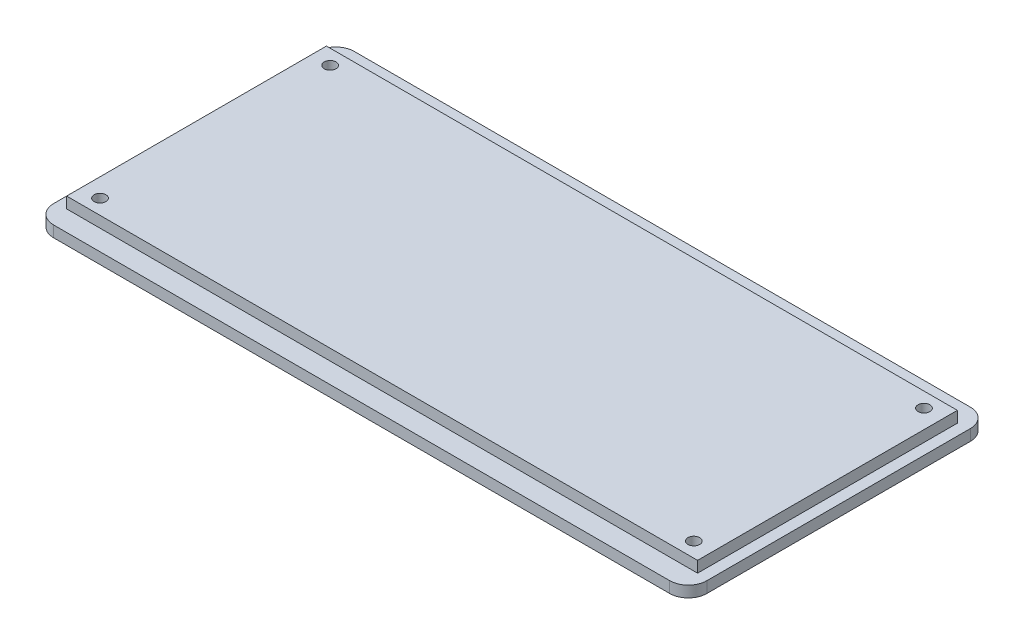
ISO-10303-21;
HEADER;
FILE_DESCRIPTION(('STEP AP214'),'2;1');
FILE_NAME('part.step','',(''),(''),'','','');
FILE_SCHEMA(('AUTOMOTIVE_DESIGN { 1 0 10303 214 1 1 1 1 }'));
ENDSEC;
DATA;
#1=APPLICATION_CONTEXT('core data for automotive mechanical design processes');
#2=APPLICATION_PROTOCOL_DEFINITION('international standard','automotive_design',2000,#1);
#3=PRODUCT_CONTEXT('',#1,'mechanical');
#4=PRODUCT('Part','Part','',(#3));
#5=PRODUCT_RELATED_PRODUCT_CATEGORY('part','',(#4));
#6=PRODUCT_DEFINITION_FORMATION('','',#4);
#7=PRODUCT_DEFINITION_CONTEXT('part definition',#1,'design');
#8=PRODUCT_DEFINITION('design','',#6,#7);
#9=PRODUCT_DEFINITION_SHAPE('','',#8);
#10=(LENGTH_UNIT() NAMED_UNIT(*) SI_UNIT(.MILLI.,.METRE.));
#11=(NAMED_UNIT(*) PLANE_ANGLE_UNIT() SI_UNIT($,.RADIAN.));
#12=(NAMED_UNIT(*) SI_UNIT($,.STERADIAN.) SOLID_ANGLE_UNIT());
#13=UNCERTAINTY_MEASURE_WITH_UNIT(LENGTH_MEASURE(1.E-05),#10,'distance_accuracy_value','');
#14=(GEOMETRIC_REPRESENTATION_CONTEXT(3) GLOBAL_UNCERTAINTY_ASSIGNED_CONTEXT((#13)) GLOBAL_UNIT_ASSIGNED_CONTEXT((#10,
#11,#12)) REPRESENTATION_CONTEXT('',''));
#15=CARTESIAN_POINT('',(0.,0.,0.));
#16=DIRECTION('',(0.,0.,1.));
#17=DIRECTION('',(1.,0.,0.));
#18=AXIS2_PLACEMENT_3D('',#15,#16,#17);
#19=CARTESIAN_POINT('',(80.,0.,-31.));
#20=DIRECTION('',(0.,1.,0.));
#21=DIRECTION('',(0.,0.,1.));
#22=AXIS2_PLACEMENT_3D('',#19,#20,#21);
#23=CYLINDRICAL_SURFACE('',#22,1.60000000000001);
#24=CARTESIAN_POINT('',(80.,6.,-31.));
#25=DIRECTION('',(0.,-1.,0.));
#26=DIRECTION('',(0.,0.,1.));
#27=AXIS2_PLACEMENT_3D('',#24,#25,#26);
#28=CIRCLE('',#27,1.60000000000001);
#29=CARTESIAN_POINT('',(80.,6.,-29.4));
#30=VERTEX_POINT('',#29);
#31=EDGE_CURVE('E248',#30,#30,#28,.T.);
#32=ORIENTED_EDGE('',*,*,#31,.F.);
#33=EDGE_LOOP('',(#32));
#34=FACE_BOUND('',#33,.T.);
#35=CARTESIAN_POINT('',(80.,2.,-31.));
#36=DIRECTION('',(0.,-1.,0.));
#37=DIRECTION('',(0.,0.,-1.));
#38=AXIS2_PLACEMENT_3D('',#35,#36,#37);
#39=CIRCLE('',#38,1.60000000000001);
#40=CARTESIAN_POINT('',(80.,2.,-32.6));
#41=VERTEX_POINT('',#40);
#42=EDGE_CURVE('E39',#41,#41,#39,.T.);
#43=ORIENTED_EDGE('',*,*,#42,.T.);
#44=EDGE_LOOP('',(#43));
#45=FACE_BOUND('',#44,.T.);
#46=ADVANCED_FACE('F35',(#34,#45),#23,.F.);
#47=CARTESIAN_POINT('',(80.,0.,31.));
#48=DIRECTION('',(0.,1.,0.));
#49=DIRECTION('',(0.,0.,1.));
#50=AXIS2_PLACEMENT_3D('',#47,#48,#49);
#51=CYLINDRICAL_SURFACE('',#50,1.60000000000001);
#52=CARTESIAN_POINT('',(80.,6.,31.));
#53=DIRECTION('',(0.,1.,0.));
#54=DIRECTION('',(0.,0.,-1.));
#55=AXIS2_PLACEMENT_3D('',#52,#53,#54);
#56=CIRCLE('',#55,1.60000000000001);
#57=CARTESIAN_POINT('',(80.,6.,29.4));
#58=VERTEX_POINT('',#57);
#59=EDGE_CURVE('E235',#58,#58,#56,.T.);
#60=ORIENTED_EDGE('',*,*,#59,.T.);
#61=EDGE_LOOP('',(#60));
#62=FACE_BOUND('',#61,.T.);
#63=CARTESIAN_POINT('',(80.,2.,31.));
#64=DIRECTION('',(0.,-1.,0.));
#65=DIRECTION('',(0.,0.,-1.));
#66=AXIS2_PLACEMENT_3D('',#63,#64,#65);
#67=CIRCLE('',#66,1.60000000000001);
#68=CARTESIAN_POINT('',(80.,2.,29.4));
#69=VERTEX_POINT('',#68);
#70=EDGE_CURVE('E233',#69,#69,#67,.F.);
#71=ORIENTED_EDGE('',*,*,#70,.F.);
#72=EDGE_LOOP('',(#71));
#73=FACE_BOUND('',#72,.T.);
#74=ADVANCED_FACE('F313',(#62,#73),#51,.F.);
#75=CARTESIAN_POINT('',(-80.,0.,31.));
#76=DIRECTION('',(0.,1.,0.));
#77=DIRECTION('',(0.,0.,1.));
#78=AXIS2_PLACEMENT_3D('',#75,#76,#77);
#79=CYLINDRICAL_SURFACE('',#78,1.60000000000001);
#80=CARTESIAN_POINT('',(-80.,6.,31.));
#81=DIRECTION('',(0.,-1.,0.));
#82=DIRECTION('',(0.,0.,-1.));
#83=AXIS2_PLACEMENT_3D('',#80,#81,#82);
#84=CIRCLE('',#83,1.60000000000001);
#85=CARTESIAN_POINT('',(-80.,6.,29.4));
#86=VERTEX_POINT('',#85);
#87=EDGE_CURVE('E231',#86,#86,#84,.T.);
#88=ORIENTED_EDGE('',*,*,#87,.F.);
#89=EDGE_LOOP('',(#88));
#90=FACE_BOUND('',#89,.T.);
#91=CARTESIAN_POINT('',(-80.,2.,31.));
#92=DIRECTION('',(0.,-1.,0.));
#93=DIRECTION('',(0.,0.,-1.));
#94=AXIS2_PLACEMENT_3D('',#91,#92,#93);
#95=CIRCLE('',#94,1.60000000000001);
#96=CARTESIAN_POINT('',(-80.,2.,29.4));
#97=VERTEX_POINT('',#96);
#98=EDGE_CURVE('E229',#97,#97,#95,.T.);
#99=ORIENTED_EDGE('',*,*,#98,.T.);
#100=EDGE_LOOP('',(#99));
#101=FACE_BOUND('',#100,.T.);
#102=ADVANCED_FACE('F319',(#90,#101),#79,.F.);
#103=CARTESIAN_POINT('',(-80.,0.,-31.));
#104=DIRECTION('',(0.,1.,0.));
#105=DIRECTION('',(0.,0.,1.));
#106=AXIS2_PLACEMENT_3D('',#103,#104,#105);
#107=CYLINDRICAL_SURFACE('',#106,1.60000000000001);
#108=CARTESIAN_POINT('',(-80.,6.,-31.));
#109=DIRECTION('',(0.,1.,0.));
#110=DIRECTION('',(0.,0.,1.));
#111=AXIS2_PLACEMENT_3D('',#108,#109,#110);
#112=CIRCLE('',#111,1.60000000000001);
#113=CARTESIAN_POINT('',(-80.,6.,-29.4));
#114=VERTEX_POINT('',#113);
#115=EDGE_CURVE('E150',#114,#114,#112,.T.);
#116=ORIENTED_EDGE('',*,*,#115,.T.);
#117=EDGE_LOOP('',(#116));
#118=FACE_BOUND('',#117,.T.);
#119=CARTESIAN_POINT('',(-80.,2.,-31.));
#120=DIRECTION('',(0.,-1.,0.));
#121=DIRECTION('',(0.,0.,-1.));
#122=AXIS2_PLACEMENT_3D('',#119,#120,#121);
#123=CIRCLE('',#122,1.60000000000001);
#124=CARTESIAN_POINT('',(-80.,2.,-32.6));
#125=VERTEX_POINT('',#124);
#126=EDGE_CURVE('E153',#125,#125,#123,.F.);
#127=ORIENTED_EDGE('',*,*,#126,.F.);
#128=EDGE_LOOP('',(#127));
#129=FACE_BOUND('',#128,.T.);
#130=ADVANCED_FACE('F345',(#118,#129),#107,.F.);
#131=CARTESIAN_POINT('',(-88.,3.,-40.5));
#132=DIRECTION('',(0.,0.,-1.));
#133=DIRECTION('',(-1.,0.,0.));
#134=AXIS2_PLACEMENT_3D('',#131,#132,#133);
#135=PLANE('',#134);
#136=DIRECTION('',(1.,0.,0.));
#137=VECTOR('',#136,1.);
#138=CARTESIAN_POINT('',(-88.,3.,-40.5));
#139=LINE('',#138,#137);
#140=CARTESIAN_POINT('',(-83.,3.,-40.5));
#141=VERTEX_POINT('',#140);
#142=CARTESIAN_POINT('',(83.,3.,-40.5));
#143=VERTEX_POINT('',#142);
#144=EDGE_CURVE('E174',#141,#143,#139,.T.);
#145=ORIENTED_EDGE('',*,*,#144,.T.);
#146=DIRECTION('',(0.,-1.,0.));
#147=VECTOR('',#146,1.);
#148=CARTESIAN_POINT('',(83.,3.,-40.5));
#149=LINE('',#148,#147);
#150=CARTESIAN_POINT('',(83.,0.,-40.5));
#151=VERTEX_POINT('',#150);
#152=EDGE_CURVE('E197',#143,#151,#149,.T.);
#153=ORIENTED_EDGE('',*,*,#152,.T.);
#154=DIRECTION('',(1.,0.,0.));
#155=VECTOR('',#154,1.);
#156=CARTESIAN_POINT('',(-88.,0.,-40.5));
#157=LINE('',#156,#155);
#158=CARTESIAN_POINT('',(-83.,0.,-40.5));
#159=VERTEX_POINT('',#158);
#160=EDGE_CURVE('E173',#159,#151,#157,.T.);
#161=ORIENTED_EDGE('',*,*,#160,.F.);
#162=DIRECTION('',(0.,-1.,0.));
#163=VECTOR('',#162,1.);
#164=CARTESIAN_POINT('',(-83.,3.,-40.5));
#165=LINE('',#164,#163);
#166=EDGE_CURVE('E186',#159,#141,#165,.F.);
#167=ORIENTED_EDGE('',*,*,#166,.T.);
#168=EDGE_LOOP('',(#145,#153,#161,#167));
#169=FACE_BOUND('',#168,.T.);
#170=ADVANCED_FACE('F278',(#169),#135,.T.);
#171=CARTESIAN_POINT('',(-88.,3.,-40.5));
#172=DIRECTION('',(1.,0.,0.));
#173=DIRECTION('',(0.,0.,-1.));
#174=AXIS2_PLACEMENT_3D('',#171,#172,#173);
#175=PLANE('',#174);
#176=DIRECTION('',(0.,0.,1.));
#177=VECTOR('',#176,1.);
#178=CARTESIAN_POINT('',(-88.,3.,-40.5));
#179=LINE('',#178,#177);
#180=CARTESIAN_POINT('',(-88.,3.,-35.5));
#181=VERTEX_POINT('',#180);
#182=CARTESIAN_POINT('',(-88.,3.,35.5));
#183=VERTEX_POINT('',#182);
#184=EDGE_CURVE('E183',#181,#183,#179,.T.);
#185=ORIENTED_EDGE('',*,*,#184,.F.);
#186=DIRECTION('',(0.,-1.,0.));
#187=VECTOR('',#186,1.);
#188=CARTESIAN_POINT('',(-88.,0.,-35.5));
#189=LINE('',#188,#187);
#190=CARTESIAN_POINT('',(-88.,0.,-35.5));
#191=VERTEX_POINT('',#190);
#192=EDGE_CURVE('E11',#181,#191,#189,.T.);
#193=ORIENTED_EDGE('',*,*,#192,.T.);
#194=DIRECTION('',(0.,0.,1.));
#195=VECTOR('',#194,1.);
#196=CARTESIAN_POINT('',(-88.,0.,-40.5));
#197=LINE('',#196,#195);
#198=CARTESIAN_POINT('',(-88.,0.,35.5));
#199=VERTEX_POINT('',#198);
#200=EDGE_CURVE('E178',#191,#199,#197,.T.);
#201=ORIENTED_EDGE('',*,*,#200,.T.);
#202=DIRECTION('',(0.,-1.,0.));
#203=VECTOR('',#202,1.);
#204=CARTESIAN_POINT('',(-88.,3.,35.5));
#205=LINE('',#204,#203);
#206=EDGE_CURVE('E44',#199,#183,#205,.F.);
#207=ORIENTED_EDGE('',*,*,#206,.T.);
#208=EDGE_LOOP('',(#185,#193,#201,#207));
#209=FACE_BOUND('',#208,.T.);
#210=ADVANCED_FACE('F290',(#209),#175,.F.);
#211=CARTESIAN_POINT('',(-88.,3.,40.5));
#212=DIRECTION('',(0.,0.,-1.));
#213=DIRECTION('',(-1.,0.,0.));
#214=AXIS2_PLACEMENT_3D('',#211,#212,#213);
#215=PLANE('',#214);
#216=DIRECTION('',(1.,0.,0.));
#217=VECTOR('',#216,1.);
#218=CARTESIAN_POINT('',(-88.,0.,40.5));
#219=LINE('',#218,#217);
#220=CARTESIAN_POINT('',(-83.,0.,40.5));
#221=VERTEX_POINT('',#220);
#222=CARTESIAN_POINT('',(83.,0.,40.5));
#223=VERTEX_POINT('',#222);
#224=EDGE_CURVE('E192',#221,#223,#219,.T.);
#225=ORIENTED_EDGE('',*,*,#224,.T.);
#226=DIRECTION('',(0.,-1.,0.));
#227=VECTOR('',#226,1.);
#228=CARTESIAN_POINT('',(83.,3.,40.5));
#229=LINE('',#228,#227);
#230=CARTESIAN_POINT('',(83.,3.,40.5));
#231=VERTEX_POINT('',#230);
#232=EDGE_CURVE('E60',#223,#231,#229,.F.);
#233=ORIENTED_EDGE('',*,*,#232,.T.);
#234=DIRECTION('',(1.,0.,0.));
#235=VECTOR('',#234,1.);
#236=CARTESIAN_POINT('',(-88.,3.,40.5));
#237=LINE('',#236,#235);
#238=CARTESIAN_POINT('',(-83.,3.,40.5));
#239=VERTEX_POINT('',#238);
#240=EDGE_CURVE('E181',#239,#231,#237,.T.);
#241=ORIENTED_EDGE('',*,*,#240,.F.);
#242=DIRECTION('',(0.,-1.,0.));
#243=VECTOR('',#242,1.);
#244=CARTESIAN_POINT('',(-83.,3.,40.5));
#245=LINE('',#244,#243);
#246=EDGE_CURVE('E221',#239,#221,#245,.T.);
#247=ORIENTED_EDGE('',*,*,#246,.T.);
#248=EDGE_LOOP('',(#225,#233,#241,#247));
#249=FACE_BOUND('',#248,.T.);
#250=ADVANCED_FACE('F295',(#249),#215,.F.);
#251=CARTESIAN_POINT('',(88.,3.,-40.5));
#252=DIRECTION('',(1.,0.,0.));
#253=DIRECTION('',(0.,0.,-1.));
#254=AXIS2_PLACEMENT_3D('',#251,#252,#253);
#255=PLANE('',#254);
#256=DIRECTION('',(0.,0.,1.));
#257=VECTOR('',#256,1.);
#258=CARTESIAN_POINT('',(88.,0.,-40.5));
#259=LINE('',#258,#257);
#260=CARTESIAN_POINT('',(88.,0.,-35.5));
#261=VERTEX_POINT('',#260);
#262=CARTESIAN_POINT('',(88.,0.,35.5));
#263=VERTEX_POINT('',#262);
#264=EDGE_CURVE('E189',#261,#263,#259,.T.);
#265=ORIENTED_EDGE('',*,*,#264,.F.);
#266=DIRECTION('',(0.,-1.,0.));
#267=VECTOR('',#266,1.);
#268=CARTESIAN_POINT('',(88.,3.,-35.5));
#269=LINE('',#268,#267);
#270=CARTESIAN_POINT('',(88.,3.,-35.5));
#271=VERTEX_POINT('',#270);
#272=EDGE_CURVE('E211',#261,#271,#269,.F.);
#273=ORIENTED_EDGE('',*,*,#272,.T.);
#274=DIRECTION('',(0.,0.,1.));
#275=VECTOR('',#274,1.);
#276=CARTESIAN_POINT('',(88.,3.,-40.5));
#277=LINE('',#276,#275);
#278=CARTESIAN_POINT('',(88.,3.,35.5));
#279=VERTEX_POINT('',#278);
#280=EDGE_CURVE('E177',#271,#279,#277,.T.);
#281=ORIENTED_EDGE('',*,*,#280,.T.);
#282=DIRECTION('',(0.,-1.,0.));
#283=VECTOR('',#282,1.);
#284=CARTESIAN_POINT('',(88.,0.,35.5));
#285=LINE('',#284,#283);
#286=EDGE_CURVE('E208',#279,#263,#285,.T.);
#287=ORIENTED_EDGE('',*,*,#286,.T.);
#288=EDGE_LOOP('',(#265,#273,#281,#287));
#289=FACE_BOUND('',#288,.T.);
#290=ADVANCED_FACE('F301',(#289),#255,.T.);
#291=CARTESIAN_POINT('',(0.,3.,0.));
#292=DIRECTION('',(0.,-1.,0.));
#293=DIRECTION('',(0.,0.,-1.));
#294=AXIS2_PLACEMENT_3D('',#291,#292,#293);
#295=PLANE('',#294);
#296=DIRECTION('',(1.,0.,0.));
#297=VECTOR('',#296,1.);
#298=CARTESIAN_POINT('',(0.,3.,-35.));
#299=LINE('',#298,#297);
#300=CARTESIAN_POINT('',(-85.,3.,-35.));
#301=VERTEX_POINT('',#300);
#302=CARTESIAN_POINT('',(85.,3.,-35.));
#303=VERTEX_POINT('',#302);
#304=EDGE_CURVE('E168',#301,#303,#299,.T.);
#305=ORIENTED_EDGE('',*,*,#304,.T.);
#306=DIRECTION('',(0.,0.,1.));
#307=VECTOR('',#306,1.);
#308=CARTESIAN_POINT('',(85.,3.,0.));
#309=LINE('',#308,#307);
#310=CARTESIAN_POINT('',(85.,3.,35.));
#311=VERTEX_POINT('',#310);
#312=EDGE_CURVE('E171',#303,#311,#309,.T.);
#313=ORIENTED_EDGE('',*,*,#312,.T.);
#314=DIRECTION('',(-1.,0.,0.));
#315=VECTOR('',#314,1.);
#316=CARTESIAN_POINT('',(0.,3.,35.));
#317=LINE('',#316,#315);
#318=CARTESIAN_POINT('',(-85.,3.,35.));
#319=VERTEX_POINT('',#318);
#320=EDGE_CURVE('E131',#311,#319,#317,.T.);
#321=ORIENTED_EDGE('',*,*,#320,.T.);
#322=DIRECTION('',(0.,0.,-1.));
#323=VECTOR('',#322,1.);
#324=CARTESIAN_POINT('',(-85.,3.,0.));
#325=LINE('',#324,#323);
#326=EDGE_CURVE('E165',#319,#301,#325,.T.);
#327=ORIENTED_EDGE('',*,*,#326,.T.);
#328=EDGE_LOOP('',(#305,#313,#321,#327));
#329=FACE_BOUND('',#328,.T.);
#330=ORIENTED_EDGE('',*,*,#280,.F.);
#331=CARTESIAN_POINT('',(83.,3.,-35.5));
#332=DIRECTION('',(0.,-1.,0.));
#333=DIRECTION('',(0.,0.,-1.));
#334=AXIS2_PLACEMENT_3D('',#331,#332,#333);
#335=CIRCLE('',#334,5.);
#336=EDGE_CURVE('E219',#271,#143,#335,.F.);
#337=ORIENTED_EDGE('',*,*,#336,.T.);
#338=ORIENTED_EDGE('',*,*,#144,.F.);
#339=CARTESIAN_POINT('',(-83.,3.,-35.5));
#340=DIRECTION('',(0.,-1.,0.));
#341=DIRECTION('',(0.,0.,-1.));
#342=AXIS2_PLACEMENT_3D('',#339,#340,#341);
#343=CIRCLE('',#342,5.);
#344=EDGE_CURVE('E215',#141,#181,#343,.F.);
#345=ORIENTED_EDGE('',*,*,#344,.T.);
#346=ORIENTED_EDGE('',*,*,#184,.T.);
#347=CARTESIAN_POINT('',(-83.,3.,35.5));
#348=DIRECTION('',(0.,-1.,0.));
#349=DIRECTION('',(0.,0.,-1.));
#350=AXIS2_PLACEMENT_3D('',#347,#348,#349);
#351=CIRCLE('',#350,5.);
#352=EDGE_CURVE('E213',#183,#239,#351,.F.);
#353=ORIENTED_EDGE('',*,*,#352,.T.);
#354=ORIENTED_EDGE('',*,*,#240,.T.);
#355=CARTESIAN_POINT('',(83.,3.,35.5));
#356=DIRECTION('',(0.,-1.,0.));
#357=DIRECTION('',(0.,0.,-1.));
#358=AXIS2_PLACEMENT_3D('',#355,#356,#357);
#359=CIRCLE('',#358,5.);
#360=EDGE_CURVE('E217',#231,#279,#359,.F.);
#361=ORIENTED_EDGE('',*,*,#360,.T.);
#362=EDGE_LOOP('',(#330,#337,#338,#345,#346,#353,#354,#361));
#363=FACE_BOUND('',#362,.T.);
#364=ADVANCED_FACE('F270',(#329,#363),#295,.F.);
#365=CARTESIAN_POINT('',(0.,0.,0.));
#366=DIRECTION('',(0.,-1.,0.));
#367=DIRECTION('',(0.,0.,-1.));
#368=AXIS2_PLACEMENT_3D('',#365,#366,#367);
#369=PLANE('',#368);
#370=CARTESIAN_POINT('',(80.,0.,-31.));
#371=DIRECTION('',(0.,1.,0.));
#372=DIRECTION('',(0.,0.,-1.));
#373=AXIS2_PLACEMENT_3D('',#370,#371,#372);
#374=CIRCLE('',#373,3.00000000000001);
#375=CARTESIAN_POINT('',(80.,0.,-34.));
#376=VERTEX_POINT('',#375);
#377=EDGE_CURVE('E459',#376,#376,#374,.T.);
#378=ORIENTED_EDGE('',*,*,#377,.T.);
#379=EDGE_LOOP('',(#378));
#380=FACE_BOUND('',#379,.T.);
#381=CARTESIAN_POINT('',(80.,0.,31.));
#382=DIRECTION('',(0.,-1.,0.));
#383=DIRECTION('',(0.,0.,1.));
#384=AXIS2_PLACEMENT_3D('',#381,#382,#383);
#385=CIRCLE('',#384,3.00000000000001);
#386=CARTESIAN_POINT('',(80.,0.,34.));
#387=VERTEX_POINT('',#386);
#388=EDGE_CURVE('E243',#387,#387,#385,.T.);
#389=ORIENTED_EDGE('',*,*,#388,.F.);
#390=EDGE_LOOP('',(#389));
#391=FACE_BOUND('',#390,.T.);
#392=CARTESIAN_POINT('',(-80.,0.,31.));
#393=DIRECTION('',(0.,1.,0.));
#394=DIRECTION('',(0.,0.,1.));
#395=AXIS2_PLACEMENT_3D('',#392,#393,#394);
#396=CIRCLE('',#395,3.00000000000001);
#397=CARTESIAN_POINT('',(-80.,0.,34.));
#398=VERTEX_POINT('',#397);
#399=EDGE_CURVE('E240',#398,#398,#396,.T.);
#400=ORIENTED_EDGE('',*,*,#399,.T.);
#401=EDGE_LOOP('',(#400));
#402=FACE_BOUND('',#401,.T.);
#403=CARTESIAN_POINT('',(-80.,0.,-31.));
#404=DIRECTION('',(0.,-1.,0.));
#405=DIRECTION('',(0.,0.,-1.));
#406=AXIS2_PLACEMENT_3D('',#403,#404,#405);
#407=CIRCLE('',#406,3.00000000000001);
#408=CARTESIAN_POINT('',(-80.,0.,-34.));
#409=VERTEX_POINT('',#408);
#410=EDGE_CURVE('E259',#409,#409,#407,.T.);
#411=ORIENTED_EDGE('',*,*,#410,.F.);
#412=EDGE_LOOP('',(#411));
#413=FACE_BOUND('',#412,.T.);
#414=ORIENTED_EDGE('',*,*,#160,.T.);
#415=CARTESIAN_POINT('',(83.,0.,-35.5));
#416=DIRECTION('',(0.,-1.,0.));
#417=DIRECTION('',(0.,0.,-1.));
#418=AXIS2_PLACEMENT_3D('',#415,#416,#417);
#419=CIRCLE('',#418,5.);
#420=EDGE_CURVE('E206',#151,#261,#419,.T.);
#421=ORIENTED_EDGE('',*,*,#420,.T.);
#422=ORIENTED_EDGE('',*,*,#264,.T.);
#423=CARTESIAN_POINT('',(83.,0.,35.5));
#424=DIRECTION('',(0.,-1.,0.));
#425=DIRECTION('',(0.,0.,-1.));
#426=AXIS2_PLACEMENT_3D('',#423,#424,#425);
#427=CIRCLE('',#426,5.);
#428=EDGE_CURVE('E204',#263,#223,#427,.T.);
#429=ORIENTED_EDGE('',*,*,#428,.T.);
#430=ORIENTED_EDGE('',*,*,#224,.F.);
#431=CARTESIAN_POINT('',(-83.,0.,35.5));
#432=DIRECTION('',(0.,-1.,0.));
#433=DIRECTION('',(0.,0.,-1.));
#434=AXIS2_PLACEMENT_3D('',#431,#432,#433);
#435=CIRCLE('',#434,5.);
#436=EDGE_CURVE('E200',#221,#199,#435,.T.);
#437=ORIENTED_EDGE('',*,*,#436,.T.);
#438=ORIENTED_EDGE('',*,*,#200,.F.);
#439=CARTESIAN_POINT('',(-83.,0.,-35.5));
#440=DIRECTION('',(0.,-1.,0.));
#441=DIRECTION('',(0.,0.,-1.));
#442=AXIS2_PLACEMENT_3D('',#439,#440,#441);
#443=CIRCLE('',#442,5.);
#444=EDGE_CURVE('E202',#191,#159,#443,.T.);
#445=ORIENTED_EDGE('',*,*,#444,.T.);
#446=EDGE_LOOP('',(#414,#421,#422,#429,#430,#437,#438,#445));
#447=FACE_BOUND('',#446,.T.);
#448=ADVANCED_FACE('F266',(#380,#391,#402,#413,#447),#369,.T.);
#449=CARTESIAN_POINT('',(83.,3.,-35.5));
#450=DIRECTION('',(0.,-1.,0.));
#451=DIRECTION('',(0.,0.,-1.));
#452=AXIS2_PLACEMENT_3D('',#449,#450,#451);
#453=CYLINDRICAL_SURFACE('',#452,5.);
#454=ORIENTED_EDGE('',*,*,#336,.F.);
#455=ORIENTED_EDGE('',*,*,#272,.F.);
#456=ORIENTED_EDGE('',*,*,#420,.F.);
#457=ORIENTED_EDGE('',*,*,#152,.F.);
#458=EDGE_LOOP('',(#454,#455,#456,#457));
#459=FACE_BOUND('',#458,.T.);
#460=ADVANCED_FACE('F269',(#459),#453,.T.);
#461=CARTESIAN_POINT('',(83.,3.,35.5));
#462=DIRECTION('',(0.,1.,0.));
#463=DIRECTION('',(0.,0.,1.));
#464=AXIS2_PLACEMENT_3D('',#461,#462,#463);
#465=CYLINDRICAL_SURFACE('',#464,5.);
#466=ORIENTED_EDGE('',*,*,#360,.F.);
#467=ORIENTED_EDGE('',*,*,#232,.F.);
#468=ORIENTED_EDGE('',*,*,#428,.F.);
#469=ORIENTED_EDGE('',*,*,#286,.F.);
#470=EDGE_LOOP('',(#466,#467,#468,#469));
#471=FACE_BOUND('',#470,.T.);
#472=ADVANCED_FACE('F299',(#471),#465,.T.);
#473=CARTESIAN_POINT('',(-83.,3.,-35.5));
#474=DIRECTION('',(0.,1.,0.));
#475=DIRECTION('',(0.,0.,1.));
#476=AXIS2_PLACEMENT_3D('',#473,#474,#475);
#477=CYLINDRICAL_SURFACE('',#476,5.);
#478=ORIENTED_EDGE('',*,*,#344,.F.);
#479=ORIENTED_EDGE('',*,*,#166,.F.);
#480=ORIENTED_EDGE('',*,*,#444,.F.);
#481=ORIENTED_EDGE('',*,*,#192,.F.);
#482=EDGE_LOOP('',(#478,#479,#480,#481));
#483=FACE_BOUND('',#482,.T.);
#484=ADVANCED_FACE('F283',(#483),#477,.T.);
#485=CARTESIAN_POINT('',(-83.,3.,35.5));
#486=DIRECTION('',(0.,-1.,0.));
#487=DIRECTION('',(0.,0.,-1.));
#488=AXIS2_PLACEMENT_3D('',#485,#486,#487);
#489=CYLINDRICAL_SURFACE('',#488,5.);
#490=ORIENTED_EDGE('',*,*,#352,.F.);
#491=ORIENTED_EDGE('',*,*,#206,.F.);
#492=ORIENTED_EDGE('',*,*,#436,.F.);
#493=ORIENTED_EDGE('',*,*,#246,.F.);
#494=EDGE_LOOP('',(#490,#491,#492,#493));
#495=FACE_BOUND('',#494,.T.);
#496=ADVANCED_FACE('F37',(#495),#489,.T.);
#497=CARTESIAN_POINT('',(85.,6.,-35.));
#498=DIRECTION('',(1.,0.,0.));
#499=DIRECTION('',(0.,0.,-1.));
#500=AXIS2_PLACEMENT_3D('',#497,#498,#499);
#501=PLANE('',#500);
#502=ORIENTED_EDGE('',*,*,#312,.F.);
#503=DIRECTION('',(0.,-1.,0.));
#504=VECTOR('',#503,1.);
#505=CARTESIAN_POINT('',(85.,6.,-35.));
#506=LINE('',#505,#504);
#507=CARTESIAN_POINT('',(85.,6.,-35.));
#508=VERTEX_POINT('',#507);
#509=EDGE_CURVE('E149',#508,#303,#506,.T.);
#510=ORIENTED_EDGE('',*,*,#509,.F.);
#511=DIRECTION('',(0.,0.,1.));
#512=VECTOR('',#511,1.);
#513=CARTESIAN_POINT('',(85.,6.,-35.));
#514=LINE('',#513,#512);
#515=CARTESIAN_POINT('',(85.,6.,35.));
#516=VERTEX_POINT('',#515);
#517=EDGE_CURVE('E142',#508,#516,#514,.T.);
#518=ORIENTED_EDGE('',*,*,#517,.T.);
#519=DIRECTION('',(0.,-1.,0.));
#520=VECTOR('',#519,1.);
#521=CARTESIAN_POINT('',(85.,6.,35.));
#522=LINE('',#521,#520);
#523=EDGE_CURVE('E126',#516,#311,#522,.T.);
#524=ORIENTED_EDGE('',*,*,#523,.T.);
#525=EDGE_LOOP('',(#502,#510,#518,#524));
#526=FACE_BOUND('',#525,.T.);
#527=ADVANCED_FACE('F147',(#526),#501,.T.);
#528=CARTESIAN_POINT('',(-85.,6.,-35.));
#529=DIRECTION('',(0.,0.,-1.));
#530=DIRECTION('',(-1.,0.,0.));
#531=AXIS2_PLACEMENT_3D('',#528,#529,#530);
#532=PLANE('',#531);
#533=ORIENTED_EDGE('',*,*,#304,.F.);
#534=DIRECTION('',(0.,-1.,0.));
#535=VECTOR('',#534,1.);
#536=CARTESIAN_POINT('',(-85.,6.,-35.));
#537=LINE('',#536,#535);
#538=CARTESIAN_POINT('',(-85.,6.,-35.));
#539=VERTEX_POINT('',#538);
#540=EDGE_CURVE('E160',#539,#301,#537,.T.);
#541=ORIENTED_EDGE('',*,*,#540,.F.);
#542=DIRECTION('',(1.,0.,0.));
#543=VECTOR('',#542,1.);
#544=CARTESIAN_POINT('',(-85.,6.,-35.));
#545=LINE('',#544,#543);
#546=EDGE_CURVE('E135',#539,#508,#545,.T.);
#547=ORIENTED_EDGE('',*,*,#546,.T.);
#548=ORIENTED_EDGE('',*,*,#509,.T.);
#549=EDGE_LOOP('',(#533,#541,#547,#548));
#550=FACE_BOUND('',#549,.T.);
#551=ADVANCED_FACE('F360',(#550),#532,.T.);
#552=CARTESIAN_POINT('',(-85.,6.,-35.));
#553=DIRECTION('',(-1.,0.,0.));
#554=DIRECTION('',(0.,0.,1.));
#555=AXIS2_PLACEMENT_3D('',#552,#553,#554);
#556=PLANE('',#555);
#557=ORIENTED_EDGE('',*,*,#326,.F.);
#558=DIRECTION('',(0.,-1.,0.));
#559=VECTOR('',#558,1.);
#560=CARTESIAN_POINT('',(-85.,6.,35.));
#561=LINE('',#560,#559);
#562=CARTESIAN_POINT('',(-85.,6.,35.));
#563=VERTEX_POINT('',#562);
#564=EDGE_CURVE('E52',#563,#319,#561,.T.);
#565=ORIENTED_EDGE('',*,*,#564,.F.);
#566=DIRECTION('',(0.,0.,-1.));
#567=VECTOR('',#566,1.);
#568=CARTESIAN_POINT('',(-85.,6.,-35.));
#569=LINE('',#568,#567);
#570=EDGE_CURVE('E145',#563,#539,#569,.T.);
#571=ORIENTED_EDGE('',*,*,#570,.T.);
#572=ORIENTED_EDGE('',*,*,#540,.T.);
#573=EDGE_LOOP('',(#557,#565,#571,#572));
#574=FACE_BOUND('',#573,.T.);
#575=ADVANCED_FACE('F363',(#574),#556,.T.);
#576=CARTESIAN_POINT('',(-85.,6.,35.));
#577=DIRECTION('',(0.,0.,1.));
#578=DIRECTION('',(1.,0.,0.));
#579=AXIS2_PLACEMENT_3D('',#576,#577,#578);
#580=PLANE('',#579);
#581=ORIENTED_EDGE('',*,*,#320,.F.);
#582=ORIENTED_EDGE('',*,*,#523,.F.);
#583=DIRECTION('',(-1.,0.,0.));
#584=VECTOR('',#583,1.);
#585=CARTESIAN_POINT('',(-85.,6.,35.));
#586=LINE('',#585,#584);
#587=EDGE_CURVE('E129',#516,#563,#586,.T.);
#588=ORIENTED_EDGE('',*,*,#587,.T.);
#589=ORIENTED_EDGE('',*,*,#564,.T.);
#590=EDGE_LOOP('',(#581,#582,#588,#589));
#591=FACE_BOUND('',#590,.T.);
#592=ADVANCED_FACE('F128',(#591),#580,.T.);
#593=CARTESIAN_POINT('',(0.,6.,0.));
#594=DIRECTION('',(0.,1.,0.));
#595=DIRECTION('',(0.,0.,1.));
#596=AXIS2_PLACEMENT_3D('',#593,#594,#595);
#597=PLANE('',#596);
#598=ORIENTED_EDGE('',*,*,#31,.T.);
#599=EDGE_LOOP('',(#598));
#600=FACE_BOUND('',#599,.T.);
#601=ORIENTED_EDGE('',*,*,#59,.F.);
#602=EDGE_LOOP('',(#601));
#603=FACE_BOUND('',#602,.T.);
#604=ORIENTED_EDGE('',*,*,#87,.T.);
#605=EDGE_LOOP('',(#604));
#606=FACE_BOUND('',#605,.T.);
#607=ORIENTED_EDGE('',*,*,#115,.F.);
#608=EDGE_LOOP('',(#607));
#609=FACE_BOUND('',#608,.T.);
#610=ORIENTED_EDGE('',*,*,#517,.F.);
#611=ORIENTED_EDGE('',*,*,#546,.F.);
#612=ORIENTED_EDGE('',*,*,#570,.F.);
#613=ORIENTED_EDGE('',*,*,#587,.F.);
#614=EDGE_LOOP('',(#610,#611,#612,#613));
#615=FACE_BOUND('',#614,.T.);
#616=ADVANCED_FACE('F140',(#600,#603,#606,#609,#615),#597,.T.);
#617=CARTESIAN_POINT('',(-80.,2.,-31.));
#618=DIRECTION('',(0.,-1.,0.));
#619=DIRECTION('',(0.,0.,-1.));
#620=AXIS2_PLACEMENT_3D('',#617,#618,#619);
#621=PLANE('',#620);
#622=CARTESIAN_POINT('',(-80.,2.,-31.));
#623=DIRECTION('',(0.,-1.,0.));
#624=DIRECTION('',(0.,0.,-1.));
#625=AXIS2_PLACEMENT_3D('',#622,#623,#624);
#626=CIRCLE('',#625,3.00000000000001);
#627=CARTESIAN_POINT('',(-80.,2.,-34.));
#628=VERTEX_POINT('',#627);
#629=EDGE_CURVE('E228',#628,#628,#626,.T.);
#630=ORIENTED_EDGE('',*,*,#629,.T.);
#631=EDGE_LOOP('',(#630));
#632=FACE_BOUND('',#631,.T.);
#633=ORIENTED_EDGE('',*,*,#126,.T.);
#634=EDGE_LOOP('',(#633));
#635=FACE_BOUND('',#634,.T.);
#636=ADVANCED_FACE('F347',(#632,#635),#621,.T.);
#637=CARTESIAN_POINT('',(-80.,2.,-31.));
#638=DIRECTION('',(0.,-1.,0.));
#639=DIRECTION('',(0.,0.,-1.));
#640=AXIS2_PLACEMENT_3D('',#637,#638,#639);
#641=CYLINDRICAL_SURFACE('',#640,3.00000000000001);
#642=ORIENTED_EDGE('',*,*,#629,.F.);
#643=EDGE_LOOP('',(#642));
#644=FACE_BOUND('',#643,.T.);
#645=ORIENTED_EDGE('',*,*,#410,.T.);
#646=EDGE_LOOP('',(#645));
#647=FACE_BOUND('',#646,.T.);
#648=ADVANCED_FACE('F264',(#644,#647),#641,.F.);
#649=CARTESIAN_POINT('',(-80.,2.,31.));
#650=DIRECTION('',(0.,-1.,0.));
#651=DIRECTION('',(0.,0.,-1.));
#652=AXIS2_PLACEMENT_3D('',#649,#650,#651);
#653=CYLINDRICAL_SURFACE('',#652,3.00000000000001);
#654=CARTESIAN_POINT('',(-80.,2.,31.));
#655=DIRECTION('',(0.,1.,0.));
#656=DIRECTION('',(0.,0.,1.));
#657=AXIS2_PLACEMENT_3D('',#654,#655,#656);
#658=CIRCLE('',#657,3.00000000000001);
#659=CARTESIAN_POINT('',(-80.,2.,34.));
#660=VERTEX_POINT('',#659);
#661=EDGE_CURVE('E232',#660,#660,#658,.T.);
#662=ORIENTED_EDGE('',*,*,#661,.T.);
#663=EDGE_LOOP('',(#662));
#664=FACE_BOUND('',#663,.T.);
#665=ORIENTED_EDGE('',*,*,#399,.F.);
#666=EDGE_LOOP('',(#665));
#667=FACE_BOUND('',#666,.T.);
#668=ADVANCED_FACE('F338',(#664,#667),#653,.F.);
#669=CARTESIAN_POINT('',(-80.,2.,31.));
#670=DIRECTION('',(0.,-1.,0.));
#671=DIRECTION('',(0.,0.,1.));
#672=AXIS2_PLACEMENT_3D('',#669,#670,#671);
#673=PLANE('',#672);
#674=ORIENTED_EDGE('',*,*,#98,.F.);
#675=EDGE_LOOP('',(#674));
#676=FACE_BOUND('',#675,.T.);
#677=ORIENTED_EDGE('',*,*,#661,.F.);
#678=EDGE_LOOP('',(#677));
#679=FACE_BOUND('',#678,.T.);
#680=ADVANCED_FACE('F332',(#676,#679),#673,.T.);
#681=CARTESIAN_POINT('',(80.,2.,31.));
#682=DIRECTION('',(0.,-1.,0.));
#683=DIRECTION('',(0.,0.,1.));
#684=AXIS2_PLACEMENT_3D('',#681,#682,#683);
#685=PLANE('',#684);
#686=CARTESIAN_POINT('',(80.,2.,31.));
#687=DIRECTION('',(0.,-1.,0.));
#688=DIRECTION('',(0.,0.,1.));
#689=AXIS2_PLACEMENT_3D('',#686,#687,#688);
#690=CIRCLE('',#689,3.00000000000001);
#691=CARTESIAN_POINT('',(80.,2.,34.));
#692=VERTEX_POINT('',#691);
#693=EDGE_CURVE('E236',#692,#692,#690,.T.);
#694=ORIENTED_EDGE('',*,*,#693,.T.);
#695=EDGE_LOOP('',(#694));
#696=FACE_BOUND('',#695,.T.);
#697=ORIENTED_EDGE('',*,*,#70,.T.);
#698=EDGE_LOOP('',(#697));
#699=FACE_BOUND('',#698,.T.);
#700=ADVANCED_FACE('F328',(#696,#699),#685,.T.);
#701=CARTESIAN_POINT('',(80.,2.,31.));
#702=DIRECTION('',(0.,-1.,0.));
#703=DIRECTION('',(0.,0.,-1.));
#704=AXIS2_PLACEMENT_3D('',#701,#702,#703);
#705=CYLINDRICAL_SURFACE('',#704,3.00000000000001);
#706=ORIENTED_EDGE('',*,*,#693,.F.);
#707=EDGE_LOOP('',(#706));
#708=FACE_BOUND('',#707,.T.);
#709=ORIENTED_EDGE('',*,*,#388,.T.);
#710=EDGE_LOOP('',(#709));
#711=FACE_BOUND('',#710,.T.);
#712=ADVANCED_FACE('F331',(#708,#711),#705,.F.);
#713=CARTESIAN_POINT('',(80.,2.,-31.));
#714=DIRECTION('',(0.,-1.,0.));
#715=DIRECTION('',(0.,0.,-1.));
#716=AXIS2_PLACEMENT_3D('',#713,#714,#715);
#717=CYLINDRICAL_SURFACE('',#716,3.00000000000001);
#718=CARTESIAN_POINT('',(80.,2.,-31.));
#719=DIRECTION('',(0.,1.,0.));
#720=DIRECTION('',(0.,0.,-1.));
#721=AXIS2_PLACEMENT_3D('',#718,#719,#720);
#722=CIRCLE('',#721,3.00000000000001);
#723=CARTESIAN_POINT('',(80.,2.,-34.));
#724=VERTEX_POINT('',#723);
#725=EDGE_CURVE('E458',#724,#724,#722,.T.);
#726=ORIENTED_EDGE('',*,*,#725,.T.);
#727=EDGE_LOOP('',(#726));
#728=FACE_BOUND('',#727,.T.);
#729=ORIENTED_EDGE('',*,*,#377,.F.);
#730=EDGE_LOOP('',(#729));
#731=FACE_BOUND('',#730,.T.);
#732=ADVANCED_FACE('F326',(#728,#731),#717,.F.);
#733=CARTESIAN_POINT('',(80.,2.,-31.));
#734=DIRECTION('',(0.,-1.,0.));
#735=DIRECTION('',(0.,0.,-1.));
#736=AXIS2_PLACEMENT_3D('',#733,#734,#735);
#737=PLANE('',#736);
#738=ORIENTED_EDGE('',*,*,#42,.F.);
#739=EDGE_LOOP('',(#738));
#740=FACE_BOUND('',#739,.T.);
#741=ORIENTED_EDGE('',*,*,#725,.F.);
#742=EDGE_LOOP('',(#741));
#743=FACE_BOUND('',#742,.T.);
#744=ADVANCED_FACE('F441',(#740,#743),#737,.T.);
#745=CLOSED_SHELL('',(#46,#74,#102,#130,#170,#210,#250,#290,#364,#448,#460,#472,#484,#496,#527,
#551,#575,#592,#616,#636,#648,#668,#680,#700,#712,#732,#744));
#746=MANIFOLD_SOLID_BREP('B2',#745);
#747=ADVANCED_BREP_SHAPE_REPRESENTATION('',(#18,#746),#14);
#748=SHAPE_DEFINITION_REPRESENTATION(#9,#747);
ENDSEC;
END-ISO-10303-21;
